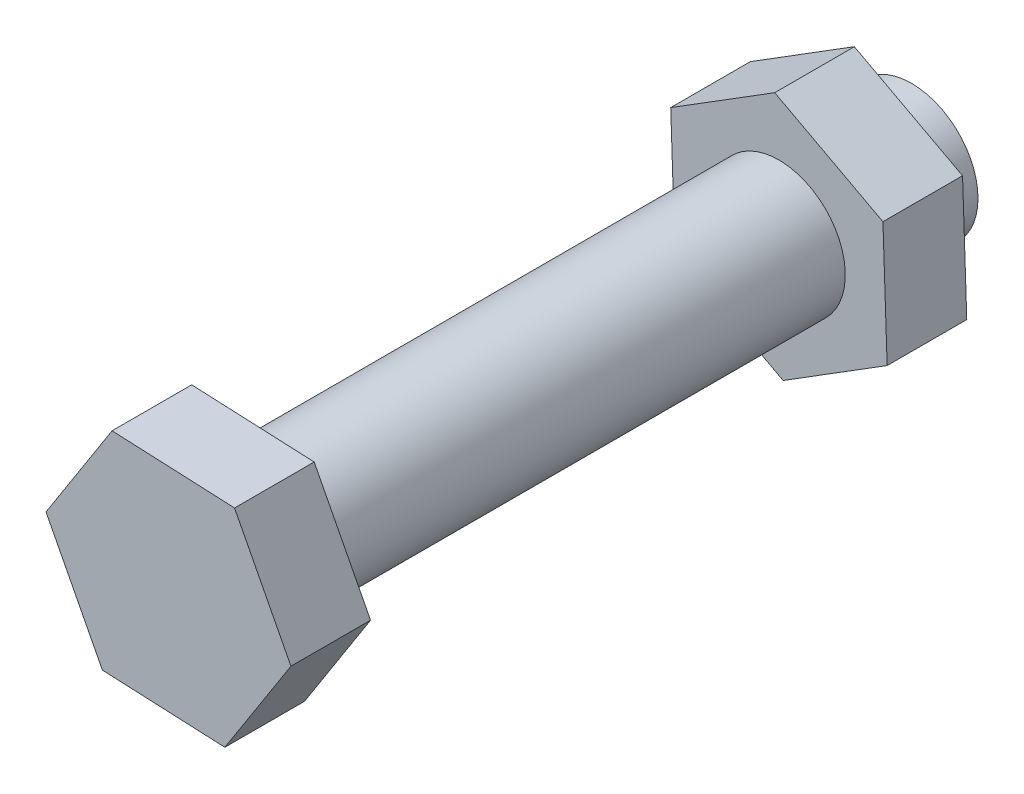
ISO-10303-21;
HEADER;
FILE_DESCRIPTION(('STEP AP214'),'2;1');
FILE_NAME('part.step','',(''),(''),'','','');
FILE_SCHEMA(('AUTOMOTIVE_DESIGN { 1 0 10303 214 1 1 1 1 }'));
ENDSEC;
DATA;
#1=APPLICATION_CONTEXT('core data for automotive mechanical design processes');
#2=APPLICATION_PROTOCOL_DEFINITION('international standard','automotive_design',2000,#1);
#3=PRODUCT_CONTEXT('',#1,'mechanical');
#4=PRODUCT('Part','Part','',(#3));
#5=PRODUCT_RELATED_PRODUCT_CATEGORY('part','',(#4));
#6=PRODUCT_DEFINITION_FORMATION('','',#4);
#7=PRODUCT_DEFINITION_CONTEXT('part definition',#1,'design');
#8=PRODUCT_DEFINITION('design','',#6,#7);
#9=PRODUCT_DEFINITION_SHAPE('','',#8);
#10=(LENGTH_UNIT() NAMED_UNIT(*) SI_UNIT(.MILLI.,.METRE.));
#11=(NAMED_UNIT(*) PLANE_ANGLE_UNIT() SI_UNIT($,.RADIAN.));
#12=(NAMED_UNIT(*) SI_UNIT($,.STERADIAN.) SOLID_ANGLE_UNIT());
#13=UNCERTAINTY_MEASURE_WITH_UNIT(LENGTH_MEASURE(1.E-05),#10,'distance_accuracy_value','');
#14=(GEOMETRIC_REPRESENTATION_CONTEXT(3) GLOBAL_UNCERTAINTY_ASSIGNED_CONTEXT((#13)) GLOBAL_UNIT_ASSIGNED_CONTEXT((#10,
#11,#12)) REPRESENTATION_CONTEXT('',''));
#15=CARTESIAN_POINT('',(0.,0.,0.));
#16=DIRECTION('',(0.,0.,1.));
#17=DIRECTION('',(1.,0.,0.));
#18=AXIS2_PLACEMENT_3D('',#15,#16,#17);
#19=CARTESIAN_POINT('',(0.,0.,0.));
#20=DIRECTION('',(0.,0.,1.));
#21=DIRECTION('',(1.,0.,0.));
#22=AXIS2_PLACEMENT_3D('',#19,#20,#21);
#23=PLANE('',#22);
#24=DIRECTION('',(-0.0343991942230051,0.999408172588562,0.));
#25=VECTOR('',#24,1.);
#26=CARTESIAN_POINT('',(-3.91819115417601,-2.44563108678929,0.));
#27=LINE('',#26,#25);
#28=CARTESIAN_POINT('',(-3.91819115417601,-2.44563108678929,0.));
#29=VERTEX_POINT('',#28);
#30=CARTESIAN_POINT('',(-4.07707422653248,2.17043753300525,0.));
#31=VERTEX_POINT('',#30);
#32=EDGE_CURVE('E227',#29,#31,#27,.T.);
#33=ORIENTED_EDGE('',*,*,#32,.T.);
#34=DIRECTION('',(0.848313269099974,0.529494662361118,0.));
#35=VECTOR('',#34,1.);
#36=CARTESIAN_POINT('',(-4.07707422653248,2.17043753300525,0.));
#37=LINE('',#36,#35);
#38=CARTESIAN_POINT('',(-0.158883072356466,4.61606861979454,0.));
#39=VERTEX_POINT('',#38);
#40=EDGE_CURVE('E229',#31,#39,#37,.T.);
#41=ORIENTED_EDGE('',*,*,#40,.T.);
#42=DIRECTION('',(0.882712463322979,-0.469913510227444,0.));
#43=VECTOR('',#42,1.);
#44=CARTESIAN_POINT('',(-0.158883072356466,4.61606861979454,0.));
#45=LINE('',#44,#43);
#46=CARTESIAN_POINT('',(3.91819115417601,2.44563108678929,0.));
#47=VERTEX_POINT('',#46);
#48=EDGE_CURVE('E254',#39,#47,#45,.T.);
#49=ORIENTED_EDGE('',*,*,#48,.T.);
#50=DIRECTION('',(0.0343991942230047,-0.999408172588562,0.));
#51=VECTOR('',#50,1.);
#52=CARTESIAN_POINT('',(3.91819115417601,2.44563108678929,0.));
#53=LINE('',#52,#51);
#54=CARTESIAN_POINT('',(4.07707422653248,-2.17043753300525,0.));
#55=VERTEX_POINT('',#54);
#56=EDGE_CURVE('E257',#47,#55,#53,.T.);
#57=ORIENTED_EDGE('',*,*,#56,.T.);
#58=DIRECTION('',(-0.848313269099974,-0.529494662361118,0.));
#59=VECTOR('',#58,1.);
#60=CARTESIAN_POINT('',(4.07707422653248,-2.17043753300525,0.));
#61=LINE('',#60,#59);
#62=CARTESIAN_POINT('',(0.158883072356467,-4.61606861979454,0.));
#63=VERTEX_POINT('',#62);
#64=EDGE_CURVE('E260',#55,#63,#61,.T.);
#65=ORIENTED_EDGE('',*,*,#64,.T.);
#66=DIRECTION('',(-0.882712463322979,0.469913510227443,0.));
#67=VECTOR('',#66,1.);
#68=CARTESIAN_POINT('',(0.158883072356467,-4.61606861979454,0.));
#69=LINE('',#68,#67);
#70=EDGE_CURVE('E236',#63,#29,#69,.T.);
#71=ORIENTED_EDGE('',*,*,#70,.T.);
#72=EDGE_LOOP('',(#33,#41,#49,#57,#65,#71));
#73=FACE_BOUND('',#72,.T.);
#74=CARTESIAN_POINT('',(0.,0.,0.));
#75=DIRECTION('',(0.,0.,1.));
#76=DIRECTION('',(1.,0.,0.));
#77=AXIS2_PLACEMENT_3D('',#74,#75,#76);
#78=CIRCLE('',#77,2.5);
#79=CARTESIAN_POINT('',(2.5,0.,0.));
#80=VERTEX_POINT('',#79);
#81=EDGE_CURVE('E11',#80,#80,#78,.F.);
#82=ORIENTED_EDGE('',*,*,#81,.F.);
#83=EDGE_LOOP('',(#82));
#84=FACE_BOUND('',#83,.T.);
#85=ADVANCED_FACE('F34',(#73,#84),#23,.F.);
#86=CARTESIAN_POINT('',(0.,0.,23.));
#87=DIRECTION('',(0.,0.,-1.));
#88=DIRECTION('',(-1.,0.,0.));
#89=AXIS2_PLACEMENT_3D('',#86,#87,#88);
#90=CYLINDRICAL_SURFACE('',#89,2.5);
#91=CARTESIAN_POINT('',(0.,0.,23.));
#92=DIRECTION('',(0.,0.,1.));
#93=DIRECTION('',(1.,0.,0.));
#94=AXIS2_PLACEMENT_3D('',#91,#92,#93);
#95=CIRCLE('',#94,2.5);
#96=CARTESIAN_POINT('',(2.5,0.,23.));
#97=VERTEX_POINT('',#96);
#98=EDGE_CURVE('E144',#97,#97,#95,.T.);
#99=ORIENTED_EDGE('',*,*,#98,.F.);
#100=EDGE_LOOP('',(#99));
#101=FACE_BOUND('',#100,.T.);
#102=CARTESIAN_POINT('',(0.,0.,3.));
#103=DIRECTION('',(0.,0.,-1.));
#104=DIRECTION('',(-1.,0.,0.));
#105=AXIS2_PLACEMENT_3D('',#102,#103,#104);
#106=CIRCLE('',#105,2.5);
#107=CARTESIAN_POINT('',(-2.5,0.,3.));
#108=VERTEX_POINT('',#107);
#109=EDGE_CURVE('E43',#108,#108,#106,.T.);
#110=ORIENTED_EDGE('',*,*,#109,.F.);
#111=EDGE_LOOP('',(#110));
#112=FACE_BOUND('',#111,.T.);
#113=ADVANCED_FACE('F36',(#101,#112),#90,.T.);
#114=CARTESIAN_POINT('',(0.,0.,23.));
#115=DIRECTION('',(0.,0.,1.));
#116=DIRECTION('',(1.,0.,0.));
#117=AXIS2_PLACEMENT_3D('',#114,#115,#116);
#118=PLANE('',#117);
#119=DIRECTION('',(-0.459965061287651,0.887937014880362,0.));
#120=VECTOR('',#119,1.);
#121=CARTESIAN_POINT('',(4.61399186733044,-0.210742453107835,23.));
#122=LINE('',#121,#120);
#123=CARTESIAN_POINT('',(4.61399186733044,-0.210742453107835,23.));
#124=VERTEX_POINT('',#123);
#125=CARTESIAN_POINT('',(2.48950425171246,3.89046294340904,23.));
#126=VERTEX_POINT('',#125);
#127=EDGE_CURVE('E124',#124,#126,#122,.T.);
#128=ORIENTED_EDGE('',*,*,#127,.F.);
#129=DIRECTION('',(0.538993481203089,0.842309935368553,0.));
#130=VECTOR('',#129,1.);
#131=CARTESIAN_POINT('',(2.12448761561798,-4.10120539651688,23.));
#132=LINE('',#131,#130);
#133=CARTESIAN_POINT('',(2.12448761561798,-4.10120539651688,23.));
#134=VERTEX_POINT('',#133);
#135=EDGE_CURVE('E81',#134,#124,#132,.T.);
#136=ORIENTED_EDGE('',*,*,#135,.F.);
#137=DIRECTION('',(0.99895854249074,-0.0456270795118092,0.));
#138=VECTOR('',#137,1.);
#139=CARTESIAN_POINT('',(-2.48950425171245,-3.89046294340904,23.));
#140=LINE('',#139,#138);
#141=CARTESIAN_POINT('',(-2.48950425171245,-3.89046294340904,23.));
#142=VERTEX_POINT('',#141);
#143=EDGE_CURVE('E75',#142,#134,#140,.T.);
#144=ORIENTED_EDGE('',*,*,#143,.F.);
#145=DIRECTION('',(0.459965061287651,-0.887937014880362,0.));
#146=VECTOR('',#145,1.);
#147=CARTESIAN_POINT('',(-4.61399186733044,0.210742453107836,23.));
#148=LINE('',#147,#146);
#149=CARTESIAN_POINT('',(-4.61399186733044,0.210742453107836,23.));
#150=VERTEX_POINT('',#149);
#151=EDGE_CURVE('E114',#150,#142,#148,.T.);
#152=ORIENTED_EDGE('',*,*,#151,.F.);
#153=DIRECTION('',(-0.538993481203089,-0.842309935368553,0.));
#154=VECTOR('',#153,1.);
#155=CARTESIAN_POINT('',(-2.12448761561798,4.10120539651688,23.));
#156=LINE('',#155,#154);
#157=CARTESIAN_POINT('',(-2.12448761561798,4.10120539651688,23.));
#158=VERTEX_POINT('',#157);
#159=EDGE_CURVE('E130',#158,#150,#156,.T.);
#160=ORIENTED_EDGE('',*,*,#159,.F.);
#161=DIRECTION('',(-0.99895854249074,0.0456270795118092,0.));
#162=VECTOR('',#161,1.);
#163=CARTESIAN_POINT('',(2.48950425171246,3.89046294340904,23.));
#164=LINE('',#163,#162);
#165=EDGE_CURVE('E127',#126,#158,#164,.T.);
#166=ORIENTED_EDGE('',*,*,#165,.F.);
#167=EDGE_LOOP('',(#128,#136,#144,#152,#160,#166));
#168=FACE_BOUND('',#167,.T.);
#169=ORIENTED_EDGE('',*,*,#98,.T.);
#170=EDGE_LOOP('',(#169));
#171=FACE_BOUND('',#170,.T.);
#172=ADVANCED_FACE('F152',(#168,#171),#118,.F.);
#173=CARTESIAN_POINT('',(4.61399186733044,-0.210742453107835,26.));
#174=DIRECTION('',(-0.887937014880362,-0.45996506128765,0.));
#175=DIRECTION('',(0.459965061287651,-0.887937014880362,0.));
#176=AXIS2_PLACEMENT_3D('',#173,#174,#175);
#177=PLANE('',#176);
#178=ORIENTED_EDGE('',*,*,#127,.T.);
#179=DIRECTION('',(0.,0.,-1.));
#180=VECTOR('',#179,1.);
#181=CARTESIAN_POINT('',(2.48950425171246,3.89046294340904,26.));
#182=LINE('',#181,#180);
#183=CARTESIAN_POINT('',(2.48950425171246,3.89046294340904,26.));
#184=VERTEX_POINT('',#183);
#185=EDGE_CURVE('E142',#184,#126,#182,.T.);
#186=ORIENTED_EDGE('',*,*,#185,.F.);
#187=DIRECTION('',(-0.459965061287651,0.887937014880362,0.));
#188=VECTOR('',#187,1.);
#189=CARTESIAN_POINT('',(4.61399186733044,-0.210742453107835,26.));
#190=LINE('',#189,#188);
#191=CARTESIAN_POINT('',(4.61399186733044,-0.210742453107835,26.));
#192=VERTEX_POINT('',#191);
#193=EDGE_CURVE('E135',#192,#184,#190,.T.);
#194=ORIENTED_EDGE('',*,*,#193,.F.);
#195=DIRECTION('',(0.,0.,-1.));
#196=VECTOR('',#195,1.);
#197=CARTESIAN_POINT('',(4.61399186733044,-0.210742453107835,26.));
#198=LINE('',#197,#196);
#199=EDGE_CURVE('E120',#192,#124,#198,.T.);
#200=ORIENTED_EDGE('',*,*,#199,.T.);
#201=EDGE_LOOP('',(#178,#186,#194,#200));
#202=FACE_BOUND('',#201,.T.);
#203=ADVANCED_FACE('F158',(#202),#177,.F.);
#204=CARTESIAN_POINT('',(2.48950425171246,3.89046294340904,26.));
#205=DIRECTION('',(-0.0456270795118092,-0.99895854249074,0.));
#206=DIRECTION('',(0.99895854249074,-0.0456270795118092,0.));
#207=AXIS2_PLACEMENT_3D('',#204,#205,#206);
#208=PLANE('',#207);
#209=ORIENTED_EDGE('',*,*,#165,.T.);
#210=DIRECTION('',(0.,0.,-1.));
#211=VECTOR('',#210,1.);
#212=CARTESIAN_POINT('',(-2.12448761561798,4.10120539651688,26.));
#213=LINE('',#212,#211);
#214=CARTESIAN_POINT('',(-2.12448761561798,4.10120539651688,26.));
#215=VERTEX_POINT('',#214);
#216=EDGE_CURVE('E139',#215,#158,#213,.T.);
#217=ORIENTED_EDGE('',*,*,#216,.F.);
#218=DIRECTION('',(-0.99895854249074,0.0456270795118092,0.));
#219=VECTOR('',#218,1.);
#220=CARTESIAN_POINT('',(2.48950425171246,3.89046294340904,26.));
#221=LINE('',#220,#219);
#222=EDGE_CURVE('E90',#184,#215,#221,.T.);
#223=ORIENTED_EDGE('',*,*,#222,.F.);
#224=ORIENTED_EDGE('',*,*,#185,.T.);
#225=EDGE_LOOP('',(#209,#217,#223,#224));
#226=FACE_BOUND('',#225,.T.);
#227=ADVANCED_FACE('F171',(#226),#208,.F.);
#228=CARTESIAN_POINT('',(-2.12448761561798,4.10120539651688,26.));
#229=DIRECTION('',(0.842309935368553,-0.538993481203089,0.));
#230=DIRECTION('',(0.538993481203089,0.842309935368553,0.));
#231=AXIS2_PLACEMENT_3D('',#228,#229,#230);
#232=PLANE('',#231);
#233=ORIENTED_EDGE('',*,*,#159,.T.);
#234=DIRECTION('',(0.,0.,-1.));
#235=VECTOR('',#234,1.);
#236=CARTESIAN_POINT('',(-4.61399186733044,0.210742453107836,26.));
#237=LINE('',#236,#235);
#238=CARTESIAN_POINT('',(-4.61399186733044,0.210742453107836,26.));
#239=VERTEX_POINT('',#238);
#240=EDGE_CURVE('E115',#239,#150,#237,.T.);
#241=ORIENTED_EDGE('',*,*,#240,.F.);
#242=DIRECTION('',(-0.538993481203089,-0.842309935368553,0.));
#243=VECTOR('',#242,1.);
#244=CARTESIAN_POINT('',(-2.12448761561798,4.10120539651688,26.));
#245=LINE('',#244,#243);
#246=EDGE_CURVE('E106',#215,#239,#245,.T.);
#247=ORIENTED_EDGE('',*,*,#246,.F.);
#248=ORIENTED_EDGE('',*,*,#216,.T.);
#249=EDGE_LOOP('',(#233,#241,#247,#248));
#250=FACE_BOUND('',#249,.T.);
#251=ADVANCED_FACE('F175',(#250),#232,.F.);
#252=CARTESIAN_POINT('',(-4.61399186733044,0.210742453107836,26.));
#253=DIRECTION('',(0.887937014880362,0.459965061287651,0.));
#254=DIRECTION('',(-0.459965061287651,0.887937014880362,0.));
#255=AXIS2_PLACEMENT_3D('',#252,#253,#254);
#256=PLANE('',#255);
#257=ORIENTED_EDGE('',*,*,#151,.T.);
#258=DIRECTION('',(0.,0.,-1.));
#259=VECTOR('',#258,1.);
#260=CARTESIAN_POINT('',(-2.48950425171245,-3.89046294340904,26.));
#261=LINE('',#260,#259);
#262=CARTESIAN_POINT('',(-2.48950425171245,-3.89046294340904,26.));
#263=VERTEX_POINT('',#262);
#264=EDGE_CURVE('E111',#263,#142,#261,.T.);
#265=ORIENTED_EDGE('',*,*,#264,.F.);
#266=DIRECTION('',(0.459965061287651,-0.887937014880362,0.));
#267=VECTOR('',#266,1.);
#268=CARTESIAN_POINT('',(-4.61399186733044,0.210742453107836,26.));
#269=LINE('',#268,#267);
#270=EDGE_CURVE('E100',#239,#263,#269,.T.);
#271=ORIENTED_EDGE('',*,*,#270,.F.);
#272=ORIENTED_EDGE('',*,*,#240,.T.);
#273=EDGE_LOOP('',(#257,#265,#271,#272));
#274=FACE_BOUND('',#273,.T.);
#275=ADVANCED_FACE('F112',(#274),#256,.F.);
#276=CARTESIAN_POINT('',(-2.48950425171245,-3.89046294340904,26.));
#277=DIRECTION('',(0.0456270795118092,0.99895854249074,0.));
#278=DIRECTION('',(-0.99895854249074,0.0456270795118092,0.));
#279=AXIS2_PLACEMENT_3D('',#276,#277,#278);
#280=PLANE('',#279);
#281=ORIENTED_EDGE('',*,*,#143,.T.);
#282=DIRECTION('',(0.,0.,-1.));
#283=VECTOR('',#282,1.);
#284=CARTESIAN_POINT('',(2.12448761561798,-4.10120539651688,26.));
#285=LINE('',#284,#283);
#286=CARTESIAN_POINT('',(2.12448761561798,-4.10120539651688,26.));
#287=VERTEX_POINT('',#286);
#288=EDGE_CURVE('E116',#287,#134,#285,.T.);
#289=ORIENTED_EDGE('',*,*,#288,.F.);
#290=DIRECTION('',(0.99895854249074,-0.0456270795118092,0.));
#291=VECTOR('',#290,1.);
#292=CARTESIAN_POINT('',(-2.48950425171245,-3.89046294340904,26.));
#293=LINE('',#292,#291);
#294=EDGE_CURVE('E104',#263,#287,#293,.T.);
#295=ORIENTED_EDGE('',*,*,#294,.F.);
#296=ORIENTED_EDGE('',*,*,#264,.T.);
#297=EDGE_LOOP('',(#281,#289,#295,#296));
#298=FACE_BOUND('',#297,.T.);
#299=ADVANCED_FACE('F118',(#298),#280,.F.);
#300=CARTESIAN_POINT('',(2.12448761561798,-4.10120539651688,26.));
#301=DIRECTION('',(-0.842309935368552,0.538993481203089,0.));
#302=DIRECTION('',(-0.538993481203089,-0.842309935368553,0.));
#303=AXIS2_PLACEMENT_3D('',#300,#301,#302);
#304=PLANE('',#303);
#305=ORIENTED_EDGE('',*,*,#135,.T.);
#306=ORIENTED_EDGE('',*,*,#199,.F.);
#307=DIRECTION('',(0.538993481203089,0.842309935368553,0.));
#308=VECTOR('',#307,1.);
#309=CARTESIAN_POINT('',(2.12448761561798,-4.10120539651688,26.));
#310=LINE('',#309,#308);
#311=EDGE_CURVE('E51',#287,#192,#310,.T.);
#312=ORIENTED_EDGE('',*,*,#311,.F.);
#313=ORIENTED_EDGE('',*,*,#288,.T.);
#314=EDGE_LOOP('',(#305,#306,#312,#313));
#315=FACE_BOUND('',#314,.T.);
#316=ADVANCED_FACE('F183',(#315),#304,.F.);
#317=CARTESIAN_POINT('',(0.,0.,26.));
#318=DIRECTION('',(0.,0.,1.));
#319=DIRECTION('',(1.,0.,0.));
#320=AXIS2_PLACEMENT_3D('',#317,#318,#319);
#321=PLANE('',#320);
#322=ORIENTED_EDGE('',*,*,#193,.T.);
#323=ORIENTED_EDGE('',*,*,#222,.T.);
#324=ORIENTED_EDGE('',*,*,#246,.T.);
#325=ORIENTED_EDGE('',*,*,#270,.T.);
#326=ORIENTED_EDGE('',*,*,#294,.T.);
#327=ORIENTED_EDGE('',*,*,#311,.T.);
#328=EDGE_LOOP('',(#322,#323,#324,#325,#326,#327));
#329=FACE_BOUND('',#328,.T.);
#330=ADVANCED_FACE('F102',(#329),#321,.T.);
#331=CARTESIAN_POINT('',(0.,0.,3.));
#332=DIRECTION('',(0.,0.,-1.));
#333=DIRECTION('',(-1.,0.,0.));
#334=AXIS2_PLACEMENT_3D('',#331,#332,#333);
#335=PLANE('',#334);
#336=DIRECTION('',(-0.0343991942230051,0.999408172588562,0.));
#337=VECTOR('',#336,1.);
#338=CARTESIAN_POINT('',(-3.91819115417601,-2.44563108678929,3.));
#339=LINE('',#338,#337);
#340=CARTESIAN_POINT('',(-3.91819115417601,-2.44563108678929,3.));
#341=VERTEX_POINT('',#340);
#342=CARTESIAN_POINT('',(-4.07707422653248,2.17043753300525,3.));
#343=VERTEX_POINT('',#342);
#344=EDGE_CURVE('E232',#341,#343,#339,.T.);
#345=ORIENTED_EDGE('',*,*,#344,.F.);
#346=DIRECTION('',(-0.882712463322979,0.469913510227443,0.));
#347=VECTOR('',#346,1.);
#348=CARTESIAN_POINT('',(0.158883072356467,-4.61606861979454,3.));
#349=LINE('',#348,#347);
#350=CARTESIAN_POINT('',(0.158883072356467,-4.61606861979454,3.));
#351=VERTEX_POINT('',#350);
#352=EDGE_CURVE('E248',#351,#341,#349,.T.);
#353=ORIENTED_EDGE('',*,*,#352,.F.);
#354=DIRECTION('',(-0.848313269099974,-0.529494662361118,0.));
#355=VECTOR('',#354,1.);
#356=CARTESIAN_POINT('',(4.07707422653248,-2.17043753300525,3.));
#357=LINE('',#356,#355);
#358=CARTESIAN_POINT('',(4.07707422653248,-2.17043753300525,3.));
#359=VERTEX_POINT('',#358);
#360=EDGE_CURVE('E245',#359,#351,#357,.T.);
#361=ORIENTED_EDGE('',*,*,#360,.F.);
#362=DIRECTION('',(0.0343991942230047,-0.999408172588562,0.));
#363=VECTOR('',#362,1.);
#364=CARTESIAN_POINT('',(3.91819115417601,2.44563108678929,3.));
#365=LINE('',#364,#363);
#366=CARTESIAN_POINT('',(3.91819115417601,2.44563108678929,3.));
#367=VERTEX_POINT('',#366);
#368=EDGE_CURVE('E242',#367,#359,#365,.T.);
#369=ORIENTED_EDGE('',*,*,#368,.F.);
#370=DIRECTION('',(0.882712463322979,-0.469913510227444,0.));
#371=VECTOR('',#370,1.);
#372=CARTESIAN_POINT('',(-0.158883072356466,4.61606861979454,3.));
#373=LINE('',#372,#371);
#374=CARTESIAN_POINT('',(-0.158883072356466,4.61606861979454,3.));
#375=VERTEX_POINT('',#374);
#376=EDGE_CURVE('E239',#375,#367,#373,.T.);
#377=ORIENTED_EDGE('',*,*,#376,.F.);
#378=DIRECTION('',(0.848313269099974,0.529494662361118,0.));
#379=VECTOR('',#378,1.);
#380=CARTESIAN_POINT('',(-4.07707422653248,2.17043753300525,3.));
#381=LINE('',#380,#379);
#382=EDGE_CURVE('E235',#343,#375,#381,.T.);
#383=ORIENTED_EDGE('',*,*,#382,.F.);
#384=EDGE_LOOP('',(#345,#353,#361,#369,#377,#383));
#385=FACE_BOUND('',#384,.T.);
#386=ORIENTED_EDGE('',*,*,#109,.T.);
#387=EDGE_LOOP('',(#386));
#388=FACE_BOUND('',#387,.T.);
#389=ADVANCED_FACE('F149',(#385,#388),#335,.F.);
#390=CARTESIAN_POINT('',(-3.91819115417601,-2.44563108678929,3.));
#391=DIRECTION('',(-0.999408172588562,-0.0343991942230051,0.));
#392=DIRECTION('',(0.0343991942230051,-0.999408172588562,0.));
#393=AXIS2_PLACEMENT_3D('',#390,#391,#392);
#394=PLANE('',#393);
#395=ORIENTED_EDGE('',*,*,#32,.F.);
#396=DIRECTION('',(0.,0.,-1.));
#397=VECTOR('',#396,1.);
#398=CARTESIAN_POINT('',(-3.91819115417601,-2.44563108678929,3.));
#399=LINE('',#398,#397);
#400=EDGE_CURVE('E128',#341,#29,#399,.T.);
#401=ORIENTED_EDGE('',*,*,#400,.F.);
#402=ORIENTED_EDGE('',*,*,#344,.T.);
#403=DIRECTION('',(0.,0.,-1.));
#404=VECTOR('',#403,1.);
#405=CARTESIAN_POINT('',(-4.07707422653248,2.17043753300525,3.));
#406=LINE('',#405,#404);
#407=EDGE_CURVE('E250',#343,#31,#406,.T.);
#408=ORIENTED_EDGE('',*,*,#407,.T.);
#409=EDGE_LOOP('',(#395,#401,#402,#408));
#410=FACE_BOUND('',#409,.T.);
#411=ADVANCED_FACE('F188',(#410),#394,.T.);
#412=CARTESIAN_POINT('',(0.158883072356467,-4.61606861979454,3.));
#413=DIRECTION('',(-0.469913510227443,-0.882712463322979,0.));
#414=DIRECTION('',(0.882712463322979,-0.469913510227443,0.));
#415=AXIS2_PLACEMENT_3D('',#412,#413,#414);
#416=PLANE('',#415);
#417=ORIENTED_EDGE('',*,*,#70,.F.);
#418=DIRECTION('',(0.,0.,-1.));
#419=VECTOR('',#418,1.);
#420=CARTESIAN_POINT('',(0.158883072356467,-4.61606861979454,3.));
#421=LINE('',#420,#419);
#422=EDGE_CURVE('E267',#351,#63,#421,.T.);
#423=ORIENTED_EDGE('',*,*,#422,.F.);
#424=ORIENTED_EDGE('',*,*,#352,.T.);
#425=ORIENTED_EDGE('',*,*,#400,.T.);
#426=EDGE_LOOP('',(#417,#423,#424,#425));
#427=FACE_BOUND('',#426,.T.);
#428=ADVANCED_FACE('F191',(#427),#416,.T.);
#429=CARTESIAN_POINT('',(4.07707422653248,-2.17043753300525,3.));
#430=DIRECTION('',(0.529494662361118,-0.848313269099974,0.));
#431=DIRECTION('',(0.848313269099974,0.529494662361118,0.));
#432=AXIS2_PLACEMENT_3D('',#429,#430,#431);
#433=PLANE('',#432);
#434=ORIENTED_EDGE('',*,*,#64,.F.);
#435=DIRECTION('',(0.,0.,-1.));
#436=VECTOR('',#435,1.);
#437=CARTESIAN_POINT('',(4.07707422653248,-2.17043753300525,3.));
#438=LINE('',#437,#436);
#439=EDGE_CURVE('E270',#359,#55,#438,.T.);
#440=ORIENTED_EDGE('',*,*,#439,.F.);
#441=ORIENTED_EDGE('',*,*,#360,.T.);
#442=ORIENTED_EDGE('',*,*,#422,.T.);
#443=EDGE_LOOP('',(#434,#440,#441,#442));
#444=FACE_BOUND('',#443,.T.);
#445=ADVANCED_FACE('F205',(#444),#433,.T.);
#446=CARTESIAN_POINT('',(3.91819115417601,2.44563108678929,3.));
#447=DIRECTION('',(0.999408172588562,0.0343991942230047,0.));
#448=DIRECTION('',(-0.0343991942230047,0.999408172588562,0.));
#449=AXIS2_PLACEMENT_3D('',#446,#447,#448);
#450=PLANE('',#449);
#451=ORIENTED_EDGE('',*,*,#56,.F.);
#452=DIRECTION('',(0.,0.,-1.));
#453=VECTOR('',#452,1.);
#454=CARTESIAN_POINT('',(3.91819115417601,2.44563108678929,3.));
#455=LINE('',#454,#453);
#456=EDGE_CURVE('E273',#367,#47,#455,.T.);
#457=ORIENTED_EDGE('',*,*,#456,.F.);
#458=ORIENTED_EDGE('',*,*,#368,.T.);
#459=ORIENTED_EDGE('',*,*,#439,.T.);
#460=EDGE_LOOP('',(#451,#457,#458,#459));
#461=FACE_BOUND('',#460,.T.);
#462=ADVANCED_FACE('F201',(#461),#450,.T.);
#463=CARTESIAN_POINT('',(-0.158883072356466,4.61606861979454,3.));
#464=DIRECTION('',(0.469913510227444,0.882712463322979,0.));
#465=DIRECTION('',(-0.882712463322979,0.469913510227444,0.));
#466=AXIS2_PLACEMENT_3D('',#463,#464,#465);
#467=PLANE('',#466);
#468=ORIENTED_EDGE('',*,*,#48,.F.);
#469=DIRECTION('',(0.,0.,-1.));
#470=VECTOR('',#469,1.);
#471=CARTESIAN_POINT('',(-0.158883072356466,4.61606861979454,3.));
#472=LINE('',#471,#470);
#473=EDGE_CURVE('E276',#375,#39,#472,.T.);
#474=ORIENTED_EDGE('',*,*,#473,.F.);
#475=ORIENTED_EDGE('',*,*,#376,.T.);
#476=ORIENTED_EDGE('',*,*,#456,.T.);
#477=EDGE_LOOP('',(#468,#474,#475,#476));
#478=FACE_BOUND('',#477,.T.);
#479=ADVANCED_FACE('F197',(#478),#467,.T.);
#480=CARTESIAN_POINT('',(-4.07707422653248,2.17043753300525,3.));
#481=DIRECTION('',(-0.529494662361118,0.848313269099974,0.));
#482=DIRECTION('',(-0.848313269099974,-0.529494662361118,0.));
#483=AXIS2_PLACEMENT_3D('',#480,#481,#482);
#484=PLANE('',#483);
#485=ORIENTED_EDGE('',*,*,#40,.F.);
#486=ORIENTED_EDGE('',*,*,#407,.F.);
#487=ORIENTED_EDGE('',*,*,#382,.T.);
#488=ORIENTED_EDGE('',*,*,#473,.T.);
#489=EDGE_LOOP('',(#485,#486,#487,#488));
#490=FACE_BOUND('',#489,.T.);
#491=ADVANCED_FACE('F193',(#490),#484,.T.);
#492=CARTESIAN_POINT('',(0.,0.,-2.));
#493=DIRECTION('',(0.,0.,1.));
#494=DIRECTION('',(1.,0.,0.));
#495=AXIS2_PLACEMENT_3D('',#492,#493,#494);
#496=CYLINDRICAL_SURFACE('',#495,2.5);
#497=CARTESIAN_POINT('',(0.,0.,-2.));
#498=DIRECTION('',(0.,0.,-1.));
#499=DIRECTION('',(-1.,0.,0.));
#500=AXIS2_PLACEMENT_3D('',#497,#498,#499);
#501=CIRCLE('',#500,2.5);
#502=CARTESIAN_POINT('',(-2.5,0.,-2.));
#503=VERTEX_POINT('',#502);
#504=EDGE_CURVE('E226',#503,#503,#501,.T.);
#505=ORIENTED_EDGE('',*,*,#504,.F.);
#506=EDGE_LOOP('',(#505));
#507=FACE_BOUND('',#506,.T.);
#508=ORIENTED_EDGE('',*,*,#81,.T.);
#509=EDGE_LOOP('',(#508));
#510=FACE_BOUND('',#509,.T.);
#511=ADVANCED_FACE('F196',(#507,#510),#496,.T.);
#512=CARTESIAN_POINT('',(0.,0.,-2.));
#513=DIRECTION('',(0.,0.,-1.));
#514=DIRECTION('',(-1.,0.,0.));
#515=AXIS2_PLACEMENT_3D('',#512,#513,#514);
#516=PLANE('',#515);
#517=ORIENTED_EDGE('',*,*,#504,.T.);
#518=EDGE_LOOP('',(#517));
#519=FACE_BOUND('',#518,.T.);
#520=ADVANCED_FACE('F218',(#519),#516,.T.);
#521=CLOSED_SHELL('',(#85,#113,#172,#203,#227,#251,#275,#299,#316,#330,#389,#411,#428,#445,#462,
#479,#491,#511,#520));
#522=MANIFOLD_SOLID_BREP('B2',#521);
#523=ADVANCED_BREP_SHAPE_REPRESENTATION('',(#18,#522),#14);
#524=SHAPE_DEFINITION_REPRESENTATION(#9,#523);
ENDSEC;
END-ISO-10303-21;
